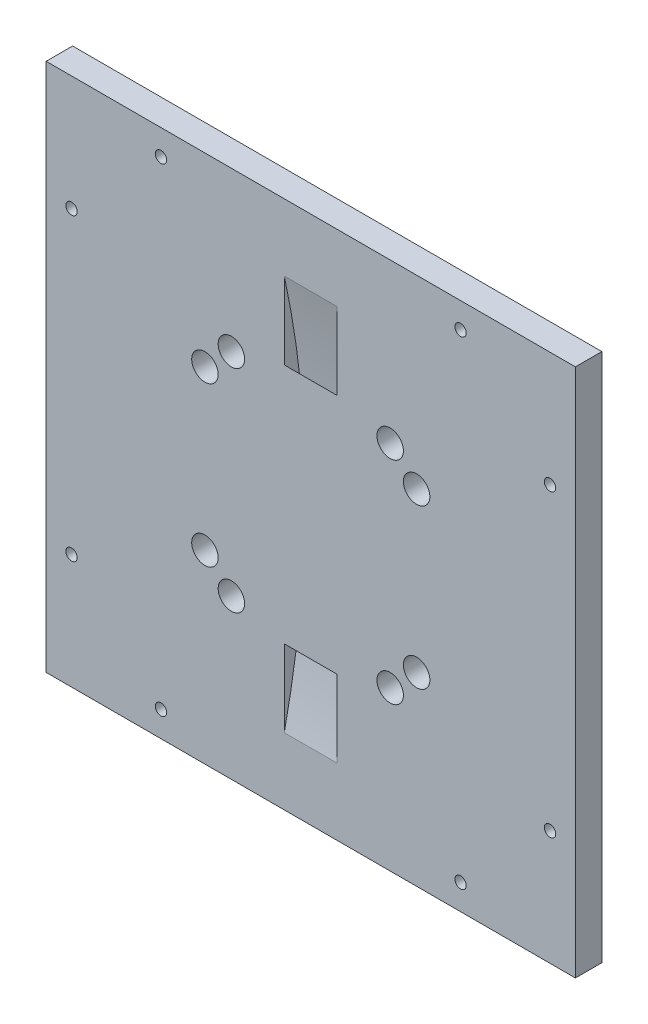
ISO-10303-21;
HEADER;
FILE_DESCRIPTION(('STEP AP214'),'2;1');
FILE_NAME('part.step','',(''),(''),'','','');
FILE_SCHEMA(('AUTOMOTIVE_DESIGN { 1 0 10303 214 1 1 1 1 }'));
ENDSEC;
DATA;
#1=APPLICATION_CONTEXT('core data for automotive mechanical design processes');
#2=APPLICATION_PROTOCOL_DEFINITION('international standard','automotive_design',2000,#1);
#3=PRODUCT_CONTEXT('',#1,'mechanical');
#4=PRODUCT('Part','Part','',(#3));
#5=PRODUCT_RELATED_PRODUCT_CATEGORY('part','',(#4));
#6=PRODUCT_DEFINITION_FORMATION('','',#4);
#7=PRODUCT_DEFINITION_CONTEXT('part definition',#1,'design');
#8=PRODUCT_DEFINITION('design','',#6,#7);
#9=PRODUCT_DEFINITION_SHAPE('','',#8);
#10=(LENGTH_UNIT() NAMED_UNIT(*) SI_UNIT(.MILLI.,.METRE.));
#11=(NAMED_UNIT(*) PLANE_ANGLE_UNIT() SI_UNIT($,.RADIAN.));
#12=(NAMED_UNIT(*) SI_UNIT($,.STERADIAN.) SOLID_ANGLE_UNIT());
#13=UNCERTAINTY_MEASURE_WITH_UNIT(LENGTH_MEASURE(1.E-05),#10,'distance_accuracy_value','');
#14=(GEOMETRIC_REPRESENTATION_CONTEXT(3) GLOBAL_UNCERTAINTY_ASSIGNED_CONTEXT((#13)) GLOBAL_UNIT_ASSIGNED_CONTEXT((#10,
#11,#12)) REPRESENTATION_CONTEXT('',''));
#15=CARTESIAN_POINT('',(0.,0.,0.));
#16=DIRECTION('',(0.,0.,1.));
#17=DIRECTION('',(1.,0.,0.));
#18=AXIS2_PLACEMENT_3D('',#15,#16,#17);
#19=CARTESIAN_POINT('',(0.,0.,10.));
#20=DIRECTION('',(0.,0.,1.));
#21=DIRECTION('',(1.,0.,0.));
#22=AXIS2_PLACEMENT_3D('',#19,#20,#21);
#23=PLANE('',#22);
#24=CARTESIAN_POINT('',(-56.6,90.4,10.));
#25=DIRECTION('',(0.,0.,1.));
#26=DIRECTION('',(1.,0.,0.));
#27=AXIS2_PLACEMENT_3D('',#24,#25,#26);
#28=CIRCLE('',#27,2.15);
#29=CARTESIAN_POINT('',(-54.45,90.4,10.));
#30=VERTEX_POINT('',#29);
#31=EDGE_CURVE('E182',#30,#30,#28,.T.);
#32=ORIENTED_EDGE('',*,*,#31,.F.);
#33=EDGE_LOOP('',(#32));
#34=FACE_BOUND('',#33,.T.);
#35=CARTESIAN_POINT('',(-30.,-40.,10.));
#36=DIRECTION('',(0.,0.,1.));
#37=DIRECTION('',(1.,0.,0.));
#38=AXIS2_PLACEMENT_3D('',#35,#36,#37);
#39=CIRCLE('',#38,5.);
#40=CARTESIAN_POINT('',(-25.,-40.,10.));
#41=VERTEX_POINT('',#40);
#42=EDGE_CURVE('E189',#41,#41,#39,.T.);
#43=ORIENTED_EDGE('',*,*,#42,.F.);
#44=EDGE_LOOP('',(#43));
#45=FACE_BOUND('',#44,.T.);
#46=CARTESIAN_POINT('',(30.,-40.,10.));
#47=DIRECTION('',(0.,0.,1.));
#48=DIRECTION('',(1.,0.,0.));
#49=AXIS2_PLACEMENT_3D('',#46,#47,#48);
#50=CIRCLE('',#49,5.);
#51=CARTESIAN_POINT('',(35.,-40.,10.));
#52=VERTEX_POINT('',#51);
#53=EDGE_CURVE('E195',#52,#52,#50,.T.);
#54=ORIENTED_EDGE('',*,*,#53,.F.);
#55=EDGE_LOOP('',(#54));
#56=FACE_BOUND('',#55,.T.);
#57=CARTESIAN_POINT('',(30.,40.,10.));
#58=DIRECTION('',(0.,0.,1.));
#59=DIRECTION('',(1.,0.,0.));
#60=AXIS2_PLACEMENT_3D('',#57,#58,#59);
#61=CIRCLE('',#60,5.);
#62=CARTESIAN_POINT('',(35.,40.,10.));
#63=VERTEX_POINT('',#62);
#64=EDGE_CURVE('E201',#63,#63,#61,.T.);
#65=ORIENTED_EDGE('',*,*,#64,.F.);
#66=EDGE_LOOP('',(#65));
#67=FACE_BOUND('',#66,.T.);
#68=CARTESIAN_POINT('',(-30.,40.,10.));
#69=DIRECTION('',(0.,0.,1.));
#70=DIRECTION('',(1.,0.,0.));
#71=AXIS2_PLACEMENT_3D('',#68,#69,#70);
#72=CIRCLE('',#71,5.);
#73=CARTESIAN_POINT('',(-25.,40.,10.));
#74=VERTEX_POINT('',#73);
#75=EDGE_CURVE('E158',#74,#74,#72,.T.);
#76=ORIENTED_EDGE('',*,*,#75,.F.);
#77=EDGE_LOOP('',(#76));
#78=FACE_BOUND('',#77,.T.);
#79=CARTESIAN_POINT('',(-40.,-30.,10.));
#80=DIRECTION('',(0.,0.,1.));
#81=DIRECTION('',(1.,0.,0.));
#82=AXIS2_PLACEMENT_3D('',#79,#80,#81);
#83=CIRCLE('',#82,5.);
#84=CARTESIAN_POINT('',(-35.,-30.,10.));
#85=VERTEX_POINT('',#84);
#86=EDGE_CURVE('E165',#85,#85,#83,.T.);
#87=ORIENTED_EDGE('',*,*,#86,.F.);
#88=EDGE_LOOP('',(#87));
#89=FACE_BOUND('',#88,.T.);
#90=CARTESIAN_POINT('',(40.,-30.,10.));
#91=DIRECTION('',(0.,0.,1.));
#92=DIRECTION('',(1.,0.,0.));
#93=AXIS2_PLACEMENT_3D('',#90,#91,#92);
#94=CIRCLE('',#93,5.);
#95=CARTESIAN_POINT('',(45.,-30.,10.));
#96=VERTEX_POINT('',#95);
#97=EDGE_CURVE('E171',#96,#96,#94,.T.);
#98=ORIENTED_EDGE('',*,*,#97,.F.);
#99=EDGE_LOOP('',(#98));
#100=FACE_BOUND('',#99,.T.);
#101=CARTESIAN_POINT('',(40.,30.,10.));
#102=DIRECTION('',(0.,0.,1.));
#103=DIRECTION('',(1.,0.,0.));
#104=AXIS2_PLACEMENT_3D('',#101,#102,#103);
#105=CIRCLE('',#104,5.);
#106=CARTESIAN_POINT('',(45.,30.,10.));
#107=VERTEX_POINT('',#106);
#108=EDGE_CURVE('E177',#107,#107,#105,.T.);
#109=ORIENTED_EDGE('',*,*,#108,.F.);
#110=EDGE_LOOP('',(#109));
#111=FACE_BOUND('',#110,.T.);
#112=CARTESIAN_POINT('',(56.6,90.4,10.));
#113=DIRECTION('',(0.,0.,1.));
#114=DIRECTION('',(1.,0.,0.));
#115=AXIS2_PLACEMENT_3D('',#112,#113,#114);
#116=CIRCLE('',#115,2.15);
#117=CARTESIAN_POINT('',(58.75,90.4,10.));
#118=VERTEX_POINT('',#117);
#119=EDGE_CURVE('E230',#118,#118,#116,.T.);
#120=ORIENTED_EDGE('',*,*,#119,.F.);
#121=EDGE_LOOP('',(#120));
#122=FACE_BOUND('',#121,.T.);
#123=CARTESIAN_POINT('',(90.4,56.6,10.));
#124=DIRECTION('',(0.,0.,1.));
#125=DIRECTION('',(1.,0.,0.));
#126=AXIS2_PLACEMENT_3D('',#123,#124,#125);
#127=CIRCLE('',#126,2.15);
#128=CARTESIAN_POINT('',(92.55,56.6,10.));
#129=VERTEX_POINT('',#128);
#130=EDGE_CURVE('E237',#129,#129,#127,.T.);
#131=ORIENTED_EDGE('',*,*,#130,.F.);
#132=EDGE_LOOP('',(#131));
#133=FACE_BOUND('',#132,.T.);
#134=CARTESIAN_POINT('',(90.4,-56.6,10.));
#135=DIRECTION('',(0.,0.,1.));
#136=DIRECTION('',(1.,0.,0.));
#137=AXIS2_PLACEMENT_3D('',#134,#135,#136);
#138=CIRCLE('',#137,2.15);
#139=CARTESIAN_POINT('',(92.55,-56.6,10.));
#140=VERTEX_POINT('',#139);
#141=EDGE_CURVE('E243',#140,#140,#138,.T.);
#142=ORIENTED_EDGE('',*,*,#141,.F.);
#143=EDGE_LOOP('',(#142));
#144=FACE_BOUND('',#143,.T.);
#145=CARTESIAN_POINT('',(56.6,-90.4,10.));
#146=DIRECTION('',(0.,0.,1.));
#147=DIRECTION('',(1.,0.,0.));
#148=AXIS2_PLACEMENT_3D('',#145,#146,#147);
#149=CIRCLE('',#148,2.15);
#150=CARTESIAN_POINT('',(58.75,-90.4,10.));
#151=VERTEX_POINT('',#150);
#152=EDGE_CURVE('E206',#151,#151,#149,.T.);
#153=ORIENTED_EDGE('',*,*,#152,.F.);
#154=EDGE_LOOP('',(#153));
#155=FACE_BOUND('',#154,.T.);
#156=CARTESIAN_POINT('',(-56.6,-90.4,10.));
#157=DIRECTION('',(0.,0.,1.));
#158=DIRECTION('',(1.,0.,0.));
#159=AXIS2_PLACEMENT_3D('',#156,#157,#158);
#160=CIRCLE('',#159,2.15);
#161=CARTESIAN_POINT('',(-54.45,-90.4,10.));
#162=VERTEX_POINT('',#161);
#163=EDGE_CURVE('E213',#162,#162,#160,.T.);
#164=ORIENTED_EDGE('',*,*,#163,.F.);
#165=EDGE_LOOP('',(#164));
#166=FACE_BOUND('',#165,.T.);
#167=CARTESIAN_POINT('',(-90.4,-56.6,10.));
#168=DIRECTION('',(0.,0.,1.));
#169=DIRECTION('',(1.,0.,0.));
#170=AXIS2_PLACEMENT_3D('',#167,#168,#169);
#171=CIRCLE('',#170,2.15);
#172=CARTESIAN_POINT('',(-88.25,-56.6,10.));
#173=VERTEX_POINT('',#172);
#174=EDGE_CURVE('E219',#173,#173,#171,.T.);
#175=ORIENTED_EDGE('',*,*,#174,.F.);
#176=EDGE_LOOP('',(#175));
#177=FACE_BOUND('',#176,.T.);
#178=CARTESIAN_POINT('',(-90.4,56.6,10.));
#179=DIRECTION('',(0.,0.,1.));
#180=DIRECTION('',(1.,0.,0.));
#181=AXIS2_PLACEMENT_3D('',#178,#179,#180);
#182=CIRCLE('',#181,2.15);
#183=CARTESIAN_POINT('',(-88.25,56.6,10.));
#184=VERTEX_POINT('',#183);
#185=EDGE_CURVE('E225',#184,#184,#182,.T.);
#186=ORIENTED_EDGE('',*,*,#185,.F.);
#187=EDGE_LOOP('',(#186));
#188=FACE_BOUND('',#187,.T.);
#189=CARTESIAN_POINT('',(-40.,30.,10.));
#190=DIRECTION('',(0.,0.,1.));
#191=DIRECTION('',(1.,0.,0.));
#192=AXIS2_PLACEMENT_3D('',#189,#190,#191);
#193=CIRCLE('',#192,5.);
#194=CARTESIAN_POINT('',(-35.,30.,10.));
#195=VERTEX_POINT('',#194);
#196=EDGE_CURVE('E152',#195,#195,#193,.T.);
#197=ORIENTED_EDGE('',*,*,#196,.F.);
#198=EDGE_LOOP('',(#197));
#199=FACE_BOUND('',#198,.T.);
#200=DIRECTION('',(0.,1.,0.));
#201=VECTOR('',#200,1.);
#202=CARTESIAN_POINT('',(100.,100.,10.));
#203=LINE('',#202,#201);
#204=CARTESIAN_POINT('',(100.,-100.,10.));
#205=VERTEX_POINT('',#204);
#206=CARTESIAN_POINT('',(100.,100.,10.));
#207=VERTEX_POINT('',#206);
#208=EDGE_CURVE('E136',#205,#207,#203,.T.);
#209=ORIENTED_EDGE('',*,*,#208,.T.);
#210=DIRECTION('',(-1.,0.,0.));
#211=VECTOR('',#210,1.);
#212=CARTESIAN_POINT('',(-100.,100.,10.));
#213=LINE('',#212,#211);
#214=CARTESIAN_POINT('',(-100.,100.,10.));
#215=VERTEX_POINT('',#214);
#216=EDGE_CURVE('E148',#207,#215,#213,.T.);
#217=ORIENTED_EDGE('',*,*,#216,.T.);
#218=DIRECTION('',(0.,-1.,0.));
#219=VECTOR('',#218,1.);
#220=CARTESIAN_POINT('',(-100.,100.,10.));
#221=LINE('',#220,#219);
#222=CARTESIAN_POINT('',(-100.,-100.,10.));
#223=VERTEX_POINT('',#222);
#224=EDGE_CURVE('E146',#215,#223,#221,.T.);
#225=ORIENTED_EDGE('',*,*,#224,.T.);
#226=DIRECTION('',(1.,0.,0.));
#227=VECTOR('',#226,1.);
#228=CARTESIAN_POINT('',(-100.,-100.,10.));
#229=LINE('',#228,#227);
#230=EDGE_CURVE('E133',#223,#205,#229,.T.);
#231=ORIENTED_EDGE('',*,*,#230,.T.);
#232=EDGE_LOOP('',(#209,#217,#225,#231));
#233=FACE_BOUND('',#232,.T.);
#234=DIRECTION('',(-1.,0.,0.));
#235=VECTOR('',#234,1.);
#236=CARTESIAN_POINT('',(0.,-45.6215835009741,10.));
#237=LINE('',#236,#235);
#238=CARTESIAN_POINT('',(-10.,-45.6215835009741,10.));
#239=VERTEX_POINT('',#238);
#240=CARTESIAN_POINT('',(10.,-45.6215835009741,10.));
#241=VERTEX_POINT('',#240);
#242=EDGE_CURVE('E115',#239,#241,#237,.F.);
#243=ORIENTED_EDGE('',*,*,#242,.T.);
#244=DIRECTION('',(0.,-1.,0.));
#245=VECTOR('',#244,1.);
#246=CARTESIAN_POINT('',(10.,0.,10.));
#247=LINE('',#246,#245);
#248=CARTESIAN_POINT('',(10.,-74.7082919168703,10.));
#249=VERTEX_POINT('',#248);
#250=EDGE_CURVE('E43',#241,#249,#247,.T.);
#251=ORIENTED_EDGE('',*,*,#250,.T.);
#252=DIRECTION('',(-1.,0.,0.));
#253=VECTOR('',#252,1.);
#254=CARTESIAN_POINT('',(0.,-74.7082919168703,10.));
#255=LINE('',#254,#253);
#256=CARTESIAN_POINT('',(-10.,-74.7082919168703,10.));
#257=VERTEX_POINT('',#256);
#258=EDGE_CURVE('E116',#249,#257,#255,.T.);
#259=ORIENTED_EDGE('',*,*,#258,.T.);
#260=DIRECTION('',(0.,1.,0.));
#261=VECTOR('',#260,1.);
#262=CARTESIAN_POINT('',(-10.,0.,10.));
#263=LINE('',#262,#261);
#264=EDGE_CURVE('E107',#257,#239,#263,.T.);
#265=ORIENTED_EDGE('',*,*,#264,.T.);
#266=EDGE_LOOP('',(#243,#251,#259,#265));
#267=FACE_BOUND('',#266,.T.);
#268=DIRECTION('',(-1.,0.,0.));
#269=VECTOR('',#268,1.);
#270=CARTESIAN_POINT('',(0.,74.7082919168703,10.));
#271=LINE('',#270,#269);
#272=CARTESIAN_POINT('',(-10.,74.7082919168703,10.));
#273=VERTEX_POINT('',#272);
#274=CARTESIAN_POINT('',(10.,74.7082919168703,10.));
#275=VERTEX_POINT('',#274);
#276=EDGE_CURVE('E97',#273,#275,#271,.F.);
#277=ORIENTED_EDGE('',*,*,#276,.T.);
#278=CARTESIAN_POINT('',(10.,45.6215835009741,10.));
#279=VERTEX_POINT('',#278);
#280=EDGE_CURVE('E11',#275,#279,#247,.T.);
#281=ORIENTED_EDGE('',*,*,#280,.T.);
#282=DIRECTION('',(-1.,0.,0.));
#283=VECTOR('',#282,1.);
#284=CARTESIAN_POINT('',(0.,45.6215835009741,10.));
#285=LINE('',#284,#283);
#286=CARTESIAN_POINT('',(-10.,45.6215835009741,10.));
#287=VERTEX_POINT('',#286);
#288=EDGE_CURVE('E37',#279,#287,#285,.T.);
#289=ORIENTED_EDGE('',*,*,#288,.T.);
#290=EDGE_CURVE('E101',#287,#273,#263,.T.);
#291=ORIENTED_EDGE('',*,*,#290,.T.);
#292=EDGE_LOOP('',(#277,#281,#289,#291));
#293=FACE_BOUND('',#292,.T.);
#294=ADVANCED_FACE('F33',(#34,#45,#56,#67,#78,#89,#100,#111,#122,#133,#144,#155,#166,#177,#188,
#199,#233,#267,#293),#23,.T.);
#295=CARTESIAN_POINT('',(100.,100.,10.));
#296=DIRECTION('',(-1.,0.,0.));
#297=DIRECTION('',(0.,-1.,0.));
#298=AXIS2_PLACEMENT_3D('',#295,#296,#297);
#299=PLANE('',#298);
#300=DIRECTION('',(0.,1.,0.));
#301=VECTOR('',#300,1.);
#302=CARTESIAN_POINT('',(100.,100.,0.));
#303=LINE('',#302,#301);
#304=CARTESIAN_POINT('',(100.,-100.,0.));
#305=VERTEX_POINT('',#304);
#306=CARTESIAN_POINT('',(100.,100.,0.));
#307=VERTEX_POINT('',#306);
#308=EDGE_CURVE('E141',#305,#307,#303,.T.);
#309=ORIENTED_EDGE('',*,*,#308,.T.);
#310=DIRECTION('',(0.,0.,-1.));
#311=VECTOR('',#310,1.);
#312=CARTESIAN_POINT('',(100.,100.,10.));
#313=LINE('',#312,#311);
#314=EDGE_CURVE('E119',#207,#307,#313,.T.);
#315=ORIENTED_EDGE('',*,*,#314,.F.);
#316=ORIENTED_EDGE('',*,*,#208,.F.);
#317=DIRECTION('',(0.,0.,-1.));
#318=VECTOR('',#317,1.);
#319=CARTESIAN_POINT('',(100.,-100.,10.));
#320=LINE('',#319,#318);
#321=EDGE_CURVE('E130',#205,#305,#320,.T.);
#322=ORIENTED_EDGE('',*,*,#321,.T.);
#323=EDGE_LOOP('',(#309,#315,#316,#322));
#324=FACE_BOUND('',#323,.T.);
#325=ADVANCED_FACE('F35',(#324),#299,.F.);
#326=CARTESIAN_POINT('',(-100.,100.,10.));
#327=DIRECTION('',(0.,-1.,0.));
#328=DIRECTION('',(0.,0.,-1.));
#329=AXIS2_PLACEMENT_3D('',#326,#327,#328);
#330=PLANE('',#329);
#331=DIRECTION('',(-1.,0.,0.));
#332=VECTOR('',#331,1.);
#333=CARTESIAN_POINT('',(-100.,100.,0.));
#334=LINE('',#333,#332);
#335=CARTESIAN_POINT('',(-100.,100.,0.));
#336=VERTEX_POINT('',#335);
#337=EDGE_CURVE('E139',#307,#336,#334,.T.);
#338=ORIENTED_EDGE('',*,*,#337,.T.);
#339=DIRECTION('',(0.,0.,-1.));
#340=VECTOR('',#339,1.);
#341=CARTESIAN_POINT('',(-100.,100.,10.));
#342=LINE('',#341,#340);
#343=EDGE_CURVE('E122',#215,#336,#342,.T.);
#344=ORIENTED_EDGE('',*,*,#343,.F.);
#345=ORIENTED_EDGE('',*,*,#216,.F.);
#346=ORIENTED_EDGE('',*,*,#314,.T.);
#347=EDGE_LOOP('',(#338,#344,#345,#346));
#348=FACE_BOUND('',#347,.T.);
#349=ADVANCED_FACE('F271',(#348),#330,.F.);
#350=CARTESIAN_POINT('',(-100.,100.,10.));
#351=DIRECTION('',(1.,0.,0.));
#352=DIRECTION('',(0.,1.,0.));
#353=AXIS2_PLACEMENT_3D('',#350,#351,#352);
#354=PLANE('',#353);
#355=DIRECTION('',(0.,-1.,0.));
#356=VECTOR('',#355,1.);
#357=CARTESIAN_POINT('',(-100.,100.,0.));
#358=LINE('',#357,#356);
#359=CARTESIAN_POINT('',(-100.,-100.,0.));
#360=VERTEX_POINT('',#359);
#361=EDGE_CURVE('E137',#336,#360,#358,.T.);
#362=ORIENTED_EDGE('',*,*,#361,.T.);
#363=DIRECTION('',(0.,0.,-1.));
#364=VECTOR('',#363,1.);
#365=CARTESIAN_POINT('',(-100.,-100.,10.));
#366=LINE('',#365,#364);
#367=EDGE_CURVE('E127',#223,#360,#366,.T.);
#368=ORIENTED_EDGE('',*,*,#367,.F.);
#369=ORIENTED_EDGE('',*,*,#224,.F.);
#370=ORIENTED_EDGE('',*,*,#343,.T.);
#371=EDGE_LOOP('',(#362,#368,#369,#370));
#372=FACE_BOUND('',#371,.T.);
#373=ADVANCED_FACE('F286',(#372),#354,.F.);
#374=CARTESIAN_POINT('',(-100.,-100.,10.));
#375=DIRECTION('',(0.,1.,0.));
#376=DIRECTION('',(0.,0.,1.));
#377=AXIS2_PLACEMENT_3D('',#374,#375,#376);
#378=PLANE('',#377);
#379=DIRECTION('',(1.,0.,0.));
#380=VECTOR('',#379,1.);
#381=CARTESIAN_POINT('',(-100.,-100.,0.));
#382=LINE('',#381,#380);
#383=EDGE_CURVE('E134',#360,#305,#382,.T.);
#384=ORIENTED_EDGE('',*,*,#383,.T.);
#385=ORIENTED_EDGE('',*,*,#321,.F.);
#386=ORIENTED_EDGE('',*,*,#230,.F.);
#387=ORIENTED_EDGE('',*,*,#367,.T.);
#388=EDGE_LOOP('',(#384,#385,#386,#387));
#389=FACE_BOUND('',#388,.T.);
#390=ADVANCED_FACE('F282',(#389),#378,.F.);
#391=CARTESIAN_POINT('',(0.,0.,0.));
#392=DIRECTION('',(0.,0.,1.));
#393=DIRECTION('',(1.,0.,0.));
#394=AXIS2_PLACEMENT_3D('',#391,#392,#393);
#395=PLANE('',#394);
#396=CARTESIAN_POINT('',(-56.6,90.4,0.));
#397=DIRECTION('',(0.,0.,1.));
#398=DIRECTION('',(1.,0.,0.));
#399=AXIS2_PLACEMENT_3D('',#396,#397,#398);
#400=CIRCLE('',#399,2.15);
#401=CARTESIAN_POINT('',(-54.45,90.4,0.));
#402=VERTEX_POINT('',#401);
#403=EDGE_CURVE('E185',#402,#402,#400,.T.);
#404=ORIENTED_EDGE('',*,*,#403,.T.);
#405=EDGE_LOOP('',(#404));
#406=FACE_BOUND('',#405,.T.);
#407=CARTESIAN_POINT('',(-30.,-40.,0.));
#408=DIRECTION('',(0.,0.,1.));
#409=DIRECTION('',(1.,0.,0.));
#410=AXIS2_PLACEMENT_3D('',#407,#408,#409);
#411=CIRCLE('',#410,5.);
#412=CARTESIAN_POINT('',(-25.,-40.,0.));
#413=VERTEX_POINT('',#412);
#414=EDGE_CURVE('E192',#413,#413,#411,.T.);
#415=ORIENTED_EDGE('',*,*,#414,.T.);
#416=EDGE_LOOP('',(#415));
#417=FACE_BOUND('',#416,.T.);
#418=CARTESIAN_POINT('',(30.,-40.,0.));
#419=DIRECTION('',(0.,0.,1.));
#420=DIRECTION('',(1.,0.,0.));
#421=AXIS2_PLACEMENT_3D('',#418,#419,#420);
#422=CIRCLE('',#421,5.);
#423=CARTESIAN_POINT('',(35.,-40.,0.));
#424=VERTEX_POINT('',#423);
#425=EDGE_CURVE('E198',#424,#424,#422,.T.);
#426=ORIENTED_EDGE('',*,*,#425,.T.);
#427=EDGE_LOOP('',(#426));
#428=FACE_BOUND('',#427,.T.);
#429=CARTESIAN_POINT('',(30.,40.,0.));
#430=DIRECTION('',(0.,0.,1.));
#431=DIRECTION('',(1.,0.,0.));
#432=AXIS2_PLACEMENT_3D('',#429,#430,#431);
#433=CIRCLE('',#432,5.);
#434=CARTESIAN_POINT('',(35.,40.,0.));
#435=VERTEX_POINT('',#434);
#436=EDGE_CURVE('E162',#435,#435,#433,.T.);
#437=ORIENTED_EDGE('',*,*,#436,.T.);
#438=EDGE_LOOP('',(#437));
#439=FACE_BOUND('',#438,.T.);
#440=CARTESIAN_POINT('',(-30.,40.,0.));
#441=DIRECTION('',(0.,0.,1.));
#442=DIRECTION('',(1.,0.,0.));
#443=AXIS2_PLACEMENT_3D('',#440,#441,#442);
#444=CIRCLE('',#443,5.);
#445=CARTESIAN_POINT('',(-25.,40.,0.));
#446=VERTEX_POINT('',#445);
#447=EDGE_CURVE('E161',#446,#446,#444,.T.);
#448=ORIENTED_EDGE('',*,*,#447,.T.);
#449=EDGE_LOOP('',(#448));
#450=FACE_BOUND('',#449,.T.);
#451=CARTESIAN_POINT('',(-40.,-30.,0.));
#452=DIRECTION('',(0.,0.,1.));
#453=DIRECTION('',(1.,0.,0.));
#454=AXIS2_PLACEMENT_3D('',#451,#452,#453);
#455=CIRCLE('',#454,5.);
#456=CARTESIAN_POINT('',(-35.,-30.,0.));
#457=VERTEX_POINT('',#456);
#458=EDGE_CURVE('E168',#457,#457,#455,.T.);
#459=ORIENTED_EDGE('',*,*,#458,.T.);
#460=EDGE_LOOP('',(#459));
#461=FACE_BOUND('',#460,.T.);
#462=CARTESIAN_POINT('',(40.,-30.,0.));
#463=DIRECTION('',(0.,0.,1.));
#464=DIRECTION('',(1.,0.,0.));
#465=AXIS2_PLACEMENT_3D('',#462,#463,#464);
#466=CIRCLE('',#465,5.);
#467=CARTESIAN_POINT('',(45.,-30.,0.));
#468=VERTEX_POINT('',#467);
#469=EDGE_CURVE('E174',#468,#468,#466,.T.);
#470=ORIENTED_EDGE('',*,*,#469,.T.);
#471=EDGE_LOOP('',(#470));
#472=FACE_BOUND('',#471,.T.);
#473=CARTESIAN_POINT('',(40.,30.,0.));
#474=DIRECTION('',(0.,0.,1.));
#475=DIRECTION('',(1.,0.,0.));
#476=AXIS2_PLACEMENT_3D('',#473,#474,#475);
#477=CIRCLE('',#476,5.);
#478=CARTESIAN_POINT('',(45.,30.,0.));
#479=VERTEX_POINT('',#478);
#480=EDGE_CURVE('E155',#479,#479,#477,.T.);
#481=ORIENTED_EDGE('',*,*,#480,.T.);
#482=EDGE_LOOP('',(#481));
#483=FACE_BOUND('',#482,.T.);
#484=CARTESIAN_POINT('',(56.6,90.4,0.));
#485=DIRECTION('',(0.,0.,1.));
#486=DIRECTION('',(1.,0.,0.));
#487=AXIS2_PLACEMENT_3D('',#484,#485,#486);
#488=CIRCLE('',#487,2.15);
#489=CARTESIAN_POINT('',(58.75,90.4,0.));
#490=VERTEX_POINT('',#489);
#491=EDGE_CURVE('E233',#490,#490,#488,.T.);
#492=ORIENTED_EDGE('',*,*,#491,.T.);
#493=EDGE_LOOP('',(#492));
#494=FACE_BOUND('',#493,.T.);
#495=CARTESIAN_POINT('',(90.4,56.6,0.));
#496=DIRECTION('',(0.,0.,1.));
#497=DIRECTION('',(1.,0.,0.));
#498=AXIS2_PLACEMENT_3D('',#495,#496,#497);
#499=CIRCLE('',#498,2.15);
#500=CARTESIAN_POINT('',(92.55,56.6,0.));
#501=VERTEX_POINT('',#500);
#502=EDGE_CURVE('E240',#501,#501,#499,.T.);
#503=ORIENTED_EDGE('',*,*,#502,.T.);
#504=EDGE_LOOP('',(#503));
#505=FACE_BOUND('',#504,.T.);
#506=CARTESIAN_POINT('',(90.4,-56.6,0.));
#507=DIRECTION('',(0.,0.,1.));
#508=DIRECTION('',(1.,0.,0.));
#509=AXIS2_PLACEMENT_3D('',#506,#507,#508);
#510=CIRCLE('',#509,2.15);
#511=CARTESIAN_POINT('',(92.55,-56.6,0.));
#512=VERTEX_POINT('',#511);
#513=EDGE_CURVE('E210',#512,#512,#510,.T.);
#514=ORIENTED_EDGE('',*,*,#513,.T.);
#515=EDGE_LOOP('',(#514));
#516=FACE_BOUND('',#515,.T.);
#517=CARTESIAN_POINT('',(56.6,-90.4,0.));
#518=DIRECTION('',(0.,0.,1.));
#519=DIRECTION('',(1.,0.,0.));
#520=AXIS2_PLACEMENT_3D('',#517,#518,#519);
#521=CIRCLE('',#520,2.15);
#522=CARTESIAN_POINT('',(58.75,-90.4,0.));
#523=VERTEX_POINT('',#522);
#524=EDGE_CURVE('E209',#523,#523,#521,.T.);
#525=ORIENTED_EDGE('',*,*,#524,.T.);
#526=EDGE_LOOP('',(#525));
#527=FACE_BOUND('',#526,.T.);
#528=CARTESIAN_POINT('',(-56.6,-90.4,0.));
#529=DIRECTION('',(0.,0.,1.));
#530=DIRECTION('',(1.,0.,0.));
#531=AXIS2_PLACEMENT_3D('',#528,#529,#530);
#532=CIRCLE('',#531,2.15);
#533=CARTESIAN_POINT('',(-54.45,-90.4,0.));
#534=VERTEX_POINT('',#533);
#535=EDGE_CURVE('E216',#534,#534,#532,.T.);
#536=ORIENTED_EDGE('',*,*,#535,.T.);
#537=EDGE_LOOP('',(#536));
#538=FACE_BOUND('',#537,.T.);
#539=CARTESIAN_POINT('',(-90.4,-56.6,0.));
#540=DIRECTION('',(0.,0.,1.));
#541=DIRECTION('',(1.,0.,0.));
#542=AXIS2_PLACEMENT_3D('',#539,#540,#541);
#543=CIRCLE('',#542,2.15);
#544=CARTESIAN_POINT('',(-88.25,-56.6,0.));
#545=VERTEX_POINT('',#544);
#546=EDGE_CURVE('E222',#545,#545,#543,.T.);
#547=ORIENTED_EDGE('',*,*,#546,.T.);
#548=EDGE_LOOP('',(#547));
#549=FACE_BOUND('',#548,.T.);
#550=CARTESIAN_POINT('',(-90.4,56.6,0.));
#551=DIRECTION('',(0.,0.,1.));
#552=DIRECTION('',(1.,0.,0.));
#553=AXIS2_PLACEMENT_3D('',#550,#551,#552);
#554=CIRCLE('',#553,2.15);
#555=CARTESIAN_POINT('',(-88.25,56.6,0.));
#556=VERTEX_POINT('',#555);
#557=EDGE_CURVE('E186',#556,#556,#554,.T.);
#558=ORIENTED_EDGE('',*,*,#557,.T.);
#559=EDGE_LOOP('',(#558));
#560=FACE_BOUND('',#559,.T.);
#561=CARTESIAN_POINT('',(-40.,30.,0.));
#562=DIRECTION('',(0.,0.,1.));
#563=DIRECTION('',(1.,0.,0.));
#564=AXIS2_PLACEMENT_3D('',#561,#562,#563);
#565=CIRCLE('',#564,5.);
#566=CARTESIAN_POINT('',(-35.,30.,0.));
#567=VERTEX_POINT('',#566);
#568=EDGE_CURVE('E144',#567,#567,#565,.T.);
#569=ORIENTED_EDGE('',*,*,#568,.T.);
#570=EDGE_LOOP('',(#569));
#571=FACE_BOUND('',#570,.T.);
#572=ORIENTED_EDGE('',*,*,#308,.F.);
#573=ORIENTED_EDGE('',*,*,#383,.F.);
#574=ORIENTED_EDGE('',*,*,#361,.F.);
#575=ORIENTED_EDGE('',*,*,#337,.F.);
#576=EDGE_LOOP('',(#572,#573,#574,#575));
#577=FACE_BOUND('',#576,.T.);
#578=ADVANCED_FACE('F279',(#406,#417,#428,#439,#450,#461,#472,#483,#494,#505,#516,#527,#538,
#549,#560,#571,#577),#395,.F.);
#579=CARTESIAN_POINT('',(-40.,30.,0.));
#580=DIRECTION('',(0.,0.,1.));
#581=DIRECTION('',(1.,0.,0.));
#582=AXIS2_PLACEMENT_3D('',#579,#580,#581);
#583=CYLINDRICAL_SURFACE('',#582,5.);
#584=ORIENTED_EDGE('',*,*,#568,.F.);
#585=EDGE_LOOP('',(#584));
#586=FACE_BOUND('',#585,.T.);
#587=ORIENTED_EDGE('',*,*,#196,.T.);
#588=EDGE_LOOP('',(#587));
#589=FACE_BOUND('',#588,.T.);
#590=ADVANCED_FACE('F277',(#586,#589),#583,.F.);
#591=CARTESIAN_POINT('',(-90.4,56.6,0.));
#592=DIRECTION('',(0.,0.,1.));
#593=DIRECTION('',(1.,0.,0.));
#594=AXIS2_PLACEMENT_3D('',#591,#592,#593);
#595=CYLINDRICAL_SURFACE('',#594,2.15);
#596=ORIENTED_EDGE('',*,*,#557,.F.);
#597=EDGE_LOOP('',(#596));
#598=FACE_BOUND('',#597,.T.);
#599=ORIENTED_EDGE('',*,*,#185,.T.);
#600=EDGE_LOOP('',(#599));
#601=FACE_BOUND('',#600,.T.);
#602=ADVANCED_FACE('F326',(#598,#601),#595,.F.);
#603=CARTESIAN_POINT('',(-90.4,-56.6,0.));
#604=DIRECTION('',(0.,0.,1.));
#605=DIRECTION('',(1.,0.,0.));
#606=AXIS2_PLACEMENT_3D('',#603,#604,#605);
#607=CYLINDRICAL_SURFACE('',#606,2.15);
#608=ORIENTED_EDGE('',*,*,#546,.F.);
#609=EDGE_LOOP('',(#608));
#610=FACE_BOUND('',#609,.T.);
#611=ORIENTED_EDGE('',*,*,#174,.T.);
#612=EDGE_LOOP('',(#611));
#613=FACE_BOUND('',#612,.T.);
#614=ADVANCED_FACE('F333',(#610,#613),#607,.F.);
#615=CARTESIAN_POINT('',(-56.6,-90.4,0.));
#616=DIRECTION('',(0.,0.,1.));
#617=DIRECTION('',(1.,0.,0.));
#618=AXIS2_PLACEMENT_3D('',#615,#616,#617);
#619=CYLINDRICAL_SURFACE('',#618,2.15);
#620=ORIENTED_EDGE('',*,*,#535,.F.);
#621=EDGE_LOOP('',(#620));
#622=FACE_BOUND('',#621,.T.);
#623=ORIENTED_EDGE('',*,*,#163,.T.);
#624=EDGE_LOOP('',(#623));
#625=FACE_BOUND('',#624,.T.);
#626=ADVANCED_FACE('F341',(#622,#625),#619,.F.);
#627=CARTESIAN_POINT('',(56.6,-90.4,0.));
#628=DIRECTION('',(0.,0.,1.));
#629=DIRECTION('',(1.,0.,0.));
#630=AXIS2_PLACEMENT_3D('',#627,#628,#629);
#631=CYLINDRICAL_SURFACE('',#630,2.15);
#632=ORIENTED_EDGE('',*,*,#524,.F.);
#633=EDGE_LOOP('',(#632));
#634=FACE_BOUND('',#633,.T.);
#635=ORIENTED_EDGE('',*,*,#152,.T.);
#636=EDGE_LOOP('',(#635));
#637=FACE_BOUND('',#636,.T.);
#638=ADVANCED_FACE('F349',(#634,#637),#631,.F.);
#639=CARTESIAN_POINT('',(90.4,-56.6,0.));
#640=DIRECTION('',(0.,0.,1.));
#641=DIRECTION('',(1.,0.,0.));
#642=AXIS2_PLACEMENT_3D('',#639,#640,#641);
#643=CYLINDRICAL_SURFACE('',#642,2.15);
#644=ORIENTED_EDGE('',*,*,#513,.F.);
#645=EDGE_LOOP('',(#644));
#646=FACE_BOUND('',#645,.T.);
#647=ORIENTED_EDGE('',*,*,#141,.T.);
#648=EDGE_LOOP('',(#647));
#649=FACE_BOUND('',#648,.T.);
#650=ADVANCED_FACE('F357',(#646,#649),#643,.F.);
#651=CARTESIAN_POINT('',(90.4,56.6,0.));
#652=DIRECTION('',(0.,0.,1.));
#653=DIRECTION('',(1.,0.,0.));
#654=AXIS2_PLACEMENT_3D('',#651,#652,#653);
#655=CYLINDRICAL_SURFACE('',#654,2.15);
#656=ORIENTED_EDGE('',*,*,#502,.F.);
#657=EDGE_LOOP('',(#656));
#658=FACE_BOUND('',#657,.T.);
#659=ORIENTED_EDGE('',*,*,#130,.T.);
#660=EDGE_LOOP('',(#659));
#661=FACE_BOUND('',#660,.T.);
#662=ADVANCED_FACE('F365',(#658,#661),#655,.F.);
#663=CARTESIAN_POINT('',(56.6,90.4,0.));
#664=DIRECTION('',(0.,0.,1.));
#665=DIRECTION('',(1.,0.,0.));
#666=AXIS2_PLACEMENT_3D('',#663,#664,#665);
#667=CYLINDRICAL_SURFACE('',#666,2.15);
#668=ORIENTED_EDGE('',*,*,#491,.F.);
#669=EDGE_LOOP('',(#668));
#670=FACE_BOUND('',#669,.T.);
#671=ORIENTED_EDGE('',*,*,#119,.T.);
#672=EDGE_LOOP('',(#671));
#673=FACE_BOUND('',#672,.T.);
#674=ADVANCED_FACE('F373',(#670,#673),#667,.F.);
#675=CARTESIAN_POINT('',(40.,30.,0.));
#676=DIRECTION('',(0.,0.,1.));
#677=DIRECTION('',(1.,0.,0.));
#678=AXIS2_PLACEMENT_3D('',#675,#676,#677);
#679=CYLINDRICAL_SURFACE('',#678,5.);
#680=ORIENTED_EDGE('',*,*,#480,.F.);
#681=EDGE_LOOP('',(#680));
#682=FACE_BOUND('',#681,.T.);
#683=ORIENTED_EDGE('',*,*,#108,.T.);
#684=EDGE_LOOP('',(#683));
#685=FACE_BOUND('',#684,.T.);
#686=ADVANCED_FACE('F381',(#682,#685),#679,.F.);
#687=CARTESIAN_POINT('',(40.,-30.,0.));
#688=DIRECTION('',(0.,0.,1.));
#689=DIRECTION('',(1.,0.,0.));
#690=AXIS2_PLACEMENT_3D('',#687,#688,#689);
#691=CYLINDRICAL_SURFACE('',#690,5.);
#692=ORIENTED_EDGE('',*,*,#469,.F.);
#693=EDGE_LOOP('',(#692));
#694=FACE_BOUND('',#693,.T.);
#695=ORIENTED_EDGE('',*,*,#97,.T.);
#696=EDGE_LOOP('',(#695));
#697=FACE_BOUND('',#696,.T.);
#698=ADVANCED_FACE('F389',(#694,#697),#691,.F.);
#699=CARTESIAN_POINT('',(-40.,-30.,0.));
#700=DIRECTION('',(0.,0.,1.));
#701=DIRECTION('',(1.,0.,0.));
#702=AXIS2_PLACEMENT_3D('',#699,#700,#701);
#703=CYLINDRICAL_SURFACE('',#702,5.);
#704=ORIENTED_EDGE('',*,*,#458,.F.);
#705=EDGE_LOOP('',(#704));
#706=FACE_BOUND('',#705,.T.);
#707=ORIENTED_EDGE('',*,*,#86,.T.);
#708=EDGE_LOOP('',(#707));
#709=FACE_BOUND('',#708,.T.);
#710=ADVANCED_FACE('F397',(#706,#709),#703,.F.);
#711=CARTESIAN_POINT('',(-30.,40.,0.));
#712=DIRECTION('',(0.,0.,1.));
#713=DIRECTION('',(1.,0.,0.));
#714=AXIS2_PLACEMENT_3D('',#711,#712,#713);
#715=CYLINDRICAL_SURFACE('',#714,5.);
#716=ORIENTED_EDGE('',*,*,#447,.F.);
#717=EDGE_LOOP('',(#716));
#718=FACE_BOUND('',#717,.T.);
#719=ORIENTED_EDGE('',*,*,#75,.T.);
#720=EDGE_LOOP('',(#719));
#721=FACE_BOUND('',#720,.T.);
#722=ADVANCED_FACE('F405',(#718,#721),#715,.F.);
#723=CARTESIAN_POINT('',(30.,40.,0.));
#724=DIRECTION('',(0.,0.,1.));
#725=DIRECTION('',(1.,0.,0.));
#726=AXIS2_PLACEMENT_3D('',#723,#724,#725);
#727=CYLINDRICAL_SURFACE('',#726,5.);
#728=ORIENTED_EDGE('',*,*,#436,.F.);
#729=EDGE_LOOP('',(#728));
#730=FACE_BOUND('',#729,.T.);
#731=ORIENTED_EDGE('',*,*,#64,.T.);
#732=EDGE_LOOP('',(#731));
#733=FACE_BOUND('',#732,.T.);
#734=ADVANCED_FACE('F413',(#730,#733),#727,.F.);
#735=CARTESIAN_POINT('',(30.,-40.,0.));
#736=DIRECTION('',(0.,0.,1.));
#737=DIRECTION('',(1.,0.,0.));
#738=AXIS2_PLACEMENT_3D('',#735,#736,#737);
#739=CYLINDRICAL_SURFACE('',#738,5.);
#740=ORIENTED_EDGE('',*,*,#425,.F.);
#741=EDGE_LOOP('',(#740));
#742=FACE_BOUND('',#741,.T.);
#743=ORIENTED_EDGE('',*,*,#53,.T.);
#744=EDGE_LOOP('',(#743));
#745=FACE_BOUND('',#744,.T.);
#746=ADVANCED_FACE('F420',(#742,#745),#739,.F.);
#747=CARTESIAN_POINT('',(-30.,-40.,0.));
#748=DIRECTION('',(0.,0.,1.));
#749=DIRECTION('',(1.,0.,0.));
#750=AXIS2_PLACEMENT_3D('',#747,#748,#749);
#751=CYLINDRICAL_SURFACE('',#750,5.);
#752=ORIENTED_EDGE('',*,*,#414,.F.);
#753=EDGE_LOOP('',(#752));
#754=FACE_BOUND('',#753,.T.);
#755=ORIENTED_EDGE('',*,*,#42,.T.);
#756=EDGE_LOOP('',(#755));
#757=FACE_BOUND('',#756,.T.);
#758=ADVANCED_FACE('F428',(#754,#757),#751,.F.);
#759=CARTESIAN_POINT('',(-56.6,90.4,0.));
#760=DIRECTION('',(0.,0.,1.));
#761=DIRECTION('',(1.,0.,0.));
#762=AXIS2_PLACEMENT_3D('',#759,#760,#761);
#763=CYLINDRICAL_SURFACE('',#762,2.15);
#764=ORIENTED_EDGE('',*,*,#403,.F.);
#765=EDGE_LOOP('',(#764));
#766=FACE_BOUND('',#765,.T.);
#767=ORIENTED_EDGE('',*,*,#31,.T.);
#768=EDGE_LOOP('',(#767));
#769=FACE_BOUND('',#768,.T.);
#770=ADVANCED_FACE('F263',(#766,#769),#763,.F.);
#771=CARTESIAN_POINT('',(10.,0.,6.99226568801755));
#772=DIRECTION('',(-1.,0.,0.));
#773=DIRECTION('',(0.,0.,1.));
#774=AXIS2_PLACEMENT_3D('',#771,#772,#773);
#775=PLANE('',#774);
#776=CARTESIAN_POINT('',(10.,0.,354.492265688017));
#777=DIRECTION('',(-1.,0.,0.));
#778=DIRECTION('',(0.,0.,1.));
#779=AXIS2_PLACEMENT_3D('',#776,#777,#778);
#780=CIRCLE('',#779,352.5);
#781=EDGE_CURVE('E50',#275,#249,#780,.T.);
#782=ORIENTED_EDGE('',*,*,#781,.T.);
#783=ORIENTED_EDGE('',*,*,#250,.F.);
#784=CARTESIAN_POINT('',(10.,0.,354.492265688017));
#785=DIRECTION('',(-1.,0.,0.));
#786=DIRECTION('',(0.,0.,1.));
#787=AXIS2_PLACEMENT_3D('',#784,#785,#786);
#788=CIRCLE('',#787,347.5);
#789=EDGE_CURVE('E234',#279,#241,#788,.T.);
#790=ORIENTED_EDGE('',*,*,#789,.F.);
#791=ORIENTED_EDGE('',*,*,#280,.F.);
#792=EDGE_LOOP('',(#782,#783,#790,#791));
#793=FACE_BOUND('',#792,.T.);
#794=ADVANCED_FACE('F252',(#793),#775,.T.);
#795=CARTESIAN_POINT('',(0.,0.,354.492265688017));
#796=DIRECTION('',(-1.,0.,0.));
#797=DIRECTION('',(0.,0.,1.));
#798=AXIS2_PLACEMENT_3D('',#795,#796,#797);
#799=CYLINDRICAL_SURFACE('',#798,347.5);
#800=ORIENTED_EDGE('',*,*,#789,.T.);
#801=ORIENTED_EDGE('',*,*,#242,.F.);
#802=CARTESIAN_POINT('',(-10.,0.,354.492265688017));
#803=DIRECTION('',(-1.,0.,0.));
#804=DIRECTION('',(0.,0.,1.));
#805=AXIS2_PLACEMENT_3D('',#802,#803,#804);
#806=CIRCLE('',#805,347.5);
#807=EDGE_CURVE('E109',#287,#239,#806,.T.);
#808=ORIENTED_EDGE('',*,*,#807,.F.);
#809=ORIENTED_EDGE('',*,*,#288,.F.);
#810=EDGE_LOOP('',(#800,#801,#808,#809));
#811=FACE_BOUND('',#810,.T.);
#812=ADVANCED_FACE('F255',(#811),#799,.T.);
#813=CARTESIAN_POINT('',(-10.,0.,6.99226568801755));
#814=DIRECTION('',(1.,0.,0.));
#815=DIRECTION('',(0.,0.,-1.));
#816=AXIS2_PLACEMENT_3D('',#813,#814,#815);
#817=PLANE('',#816);
#818=CARTESIAN_POINT('',(-10.,0.,354.492265688017));
#819=DIRECTION('',(-1.,0.,0.));
#820=DIRECTION('',(0.,0.,1.));
#821=AXIS2_PLACEMENT_3D('',#818,#819,#820);
#822=CIRCLE('',#821,352.5);
#823=EDGE_CURVE('E55',#273,#257,#822,.T.);
#824=ORIENTED_EDGE('',*,*,#823,.F.);
#825=ORIENTED_EDGE('',*,*,#290,.F.);
#826=ORIENTED_EDGE('',*,*,#807,.T.);
#827=ORIENTED_EDGE('',*,*,#264,.F.);
#828=EDGE_LOOP('',(#824,#825,#826,#827));
#829=FACE_BOUND('',#828,.T.);
#830=ADVANCED_FACE('F103',(#829),#817,.T.);
#831=CARTESIAN_POINT('',(0.,0.,354.492265688017));
#832=DIRECTION('',(-1.,0.,0.));
#833=DIRECTION('',(0.,0.,1.));
#834=AXIS2_PLACEMENT_3D('',#831,#832,#833);
#835=CYLINDRICAL_SURFACE('',#834,352.5);
#836=ORIENTED_EDGE('',*,*,#823,.T.);
#837=ORIENTED_EDGE('',*,*,#258,.F.);
#838=ORIENTED_EDGE('',*,*,#781,.F.);
#839=ORIENTED_EDGE('',*,*,#276,.F.);
#840=EDGE_LOOP('',(#836,#837,#838,#839));
#841=FACE_BOUND('',#840,.T.);
#842=ADVANCED_FACE('F98',(#841),#835,.F.);
#843=CLOSED_SHELL('',(#294,#325,#349,#373,#390,#578,#590,#602,#614,#626,#638,#650,#662,#674,
#686,#698,#710,#722,#734,#746,#758,#770,#794,#812,#830,#842));
#844=MANIFOLD_SOLID_BREP('B2',#843);
#845=ADVANCED_BREP_SHAPE_REPRESENTATION('',(#18,#844),#14);
#846=SHAPE_DEFINITION_REPRESENTATION(#9,#845);
ENDSEC;
END-ISO-10303-21;
